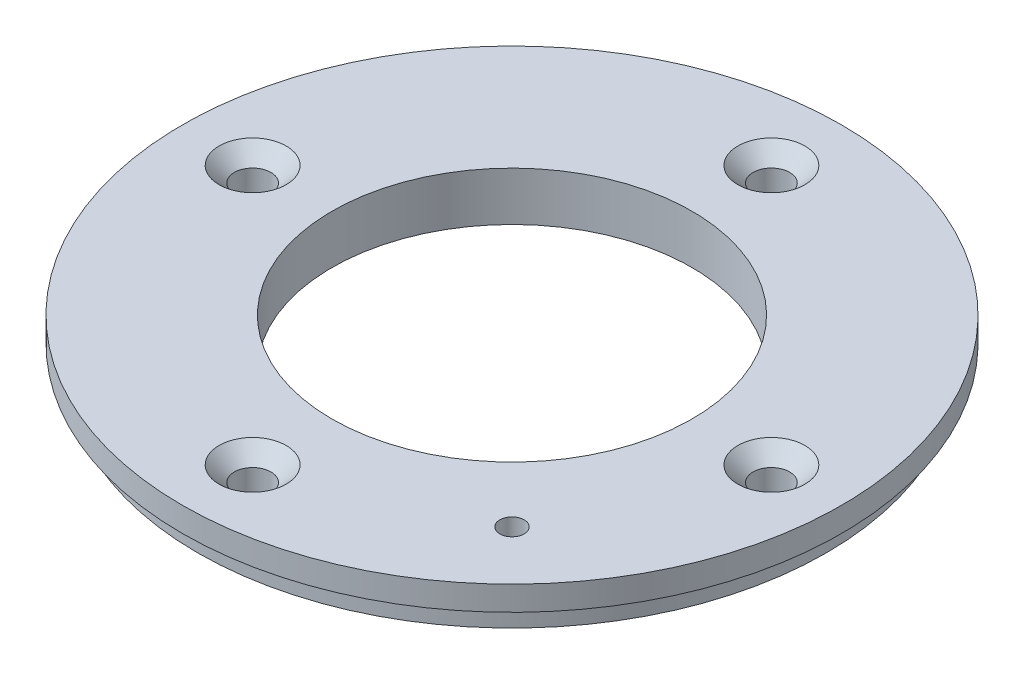
ISO-10303-21;
HEADER;
FILE_DESCRIPTION(('STEP AP214'),'2;1');
FILE_NAME('part.step','',(''),(''),'','','');
FILE_SCHEMA(('AUTOMOTIVE_DESIGN { 1 0 10303 214 1 1 1 1 }'));
ENDSEC;
DATA;
#1=APPLICATION_CONTEXT('core data for automotive mechanical design processes');
#2=APPLICATION_PROTOCOL_DEFINITION('international standard','automotive_design',2000,#1);
#3=PRODUCT_CONTEXT('',#1,'mechanical');
#4=PRODUCT('Part','Part','',(#3));
#5=PRODUCT_RELATED_PRODUCT_CATEGORY('part','',(#4));
#6=PRODUCT_DEFINITION_FORMATION('','',#4);
#7=PRODUCT_DEFINITION_CONTEXT('part definition',#1,'design');
#8=PRODUCT_DEFINITION('design','',#6,#7);
#9=PRODUCT_DEFINITION_SHAPE('','',#8);
#10=(LENGTH_UNIT() NAMED_UNIT(*) SI_UNIT(.MILLI.,.METRE.));
#11=(NAMED_UNIT(*) PLANE_ANGLE_UNIT() SI_UNIT($,.RADIAN.));
#12=(NAMED_UNIT(*) SI_UNIT($,.STERADIAN.) SOLID_ANGLE_UNIT());
#13=UNCERTAINTY_MEASURE_WITH_UNIT(LENGTH_MEASURE(1.E-05),#10,'distance_accuracy_value','');
#14=(GEOMETRIC_REPRESENTATION_CONTEXT(3) GLOBAL_UNCERTAINTY_ASSIGNED_CONTEXT((#13)) GLOBAL_UNIT_ASSIGNED_CONTEXT((#10,
#11,#12)) REPRESENTATION_CONTEXT('',''));
#15=CARTESIAN_POINT('',(0.,0.,0.));
#16=DIRECTION('',(0.,0.,1.));
#17=DIRECTION('',(1.,0.,0.));
#18=AXIS2_PLACEMENT_3D('',#15,#16,#17);
#19=CARTESIAN_POINT('',(0.,4.,0.));
#20=DIRECTION('',(0.,-1.,0.));
#21=DIRECTION('',(0.,0.,-1.));
#22=AXIS2_PLACEMENT_3D('',#19,#20,#21);
#23=CYLINDRICAL_SURFACE('',#22,51.5);
#24=CARTESIAN_POINT('',(0.,4.,0.));
#25=DIRECTION('',(0.,1.,0.));
#26=DIRECTION('',(0.,0.,1.));
#27=AXIS2_PLACEMENT_3D('',#24,#25,#26);
#28=CIRCLE('',#27,51.5);
#29=CARTESIAN_POINT('',(0.,4.,51.5));
#30=VERTEX_POINT('',#29);
#31=EDGE_CURVE('E65',#30,#30,#28,.T.);
#32=ORIENTED_EDGE('',*,*,#31,.F.);
#33=EDGE_LOOP('',(#32));
#34=FACE_BOUND('',#33,.T.);
#35=CARTESIAN_POINT('',(0.,0.,0.));
#36=DIRECTION('',(0.,1.,0.));
#37=DIRECTION('',(0.,0.,1.));
#38=AXIS2_PLACEMENT_3D('',#35,#36,#37);
#39=CIRCLE('',#38,51.5);
#40=CARTESIAN_POINT('',(0.,0.,51.5));
#41=VERTEX_POINT('',#40);
#42=EDGE_CURVE('E66',#41,#41,#39,.T.);
#43=ORIENTED_EDGE('',*,*,#42,.T.);
#44=EDGE_LOOP('',(#43));
#45=FACE_BOUND('',#44,.T.);
#46=ADVANCED_FACE('F33',(#34,#45),#23,.T.);
#47=CARTESIAN_POINT('',(0.,0.,0.));
#48=DIRECTION('',(0.,1.,0.));
#49=DIRECTION('',(0.,0.,1.));
#50=AXIS2_PLACEMENT_3D('',#47,#48,#49);
#51=PLANE('',#50);
#52=CARTESIAN_POINT('',(30.0520382004282,0.,30.0520382004283));
#53=DIRECTION('',(0.,1.,0.));
#54=DIRECTION('',(0.,0.,1.));
#55=AXIS2_PLACEMENT_3D('',#52,#53,#54);
#56=CIRCLE('',#55,2.);
#57=CARTESIAN_POINT('',(30.0520382004282,0.,32.0520382004283));
#58=VERTEX_POINT('',#57);
#59=EDGE_CURVE('E95',#58,#58,#56,.T.);
#60=ORIENTED_EDGE('',*,*,#59,.T.);
#61=EDGE_LOOP('',(#60));
#62=FACE_BOUND('',#61,.T.);
#63=CARTESIAN_POINT('',(42.5,0.,0.));
#64=DIRECTION('',(0.,1.,0.));
#65=DIRECTION('',(0.,0.,1.));
#66=AXIS2_PLACEMENT_3D('',#63,#64,#65);
#67=CIRCLE('',#66,3.);
#68=CARTESIAN_POINT('',(42.5,0.,3.));
#69=VERTEX_POINT('',#68);
#70=EDGE_CURVE('E92',#69,#69,#67,.T.);
#71=ORIENTED_EDGE('',*,*,#70,.T.);
#72=EDGE_LOOP('',(#71));
#73=FACE_BOUND('',#72,.T.);
#74=CARTESIAN_POINT('',(0.,0.,42.5));
#75=DIRECTION('',(0.,1.,0.));
#76=DIRECTION('',(0.,0.,1.));
#77=AXIS2_PLACEMENT_3D('',#74,#75,#76);
#78=CIRCLE('',#77,3.);
#79=CARTESIAN_POINT('',(0.,0.,45.5));
#80=VERTEX_POINT('',#79);
#81=EDGE_CURVE('E89',#80,#80,#78,.T.);
#82=ORIENTED_EDGE('',*,*,#81,.T.);
#83=EDGE_LOOP('',(#82));
#84=FACE_BOUND('',#83,.T.);
#85=CARTESIAN_POINT('',(-42.5,0.,0.));
#86=DIRECTION('',(0.,1.,0.));
#87=DIRECTION('',(0.,0.,1.));
#88=AXIS2_PLACEMENT_3D('',#85,#86,#87);
#89=CIRCLE('',#88,3.);
#90=CARTESIAN_POINT('',(-42.5,0.,3.));
#91=VERTEX_POINT('',#90);
#92=EDGE_CURVE('E86',#91,#91,#89,.T.);
#93=ORIENTED_EDGE('',*,*,#92,.T.);
#94=EDGE_LOOP('',(#93));
#95=FACE_BOUND('',#94,.T.);
#96=CARTESIAN_POINT('',(0.,0.,-42.5));
#97=DIRECTION('',(0.,1.,0.));
#98=DIRECTION('',(0.,0.,1.));
#99=AXIS2_PLACEMENT_3D('',#96,#97,#98);
#100=CIRCLE('',#99,3.);
#101=CARTESIAN_POINT('',(0.,0.,-39.5));
#102=VERTEX_POINT('',#101);
#103=EDGE_CURVE('E83',#102,#102,#100,.T.);
#104=ORIENTED_EDGE('',*,*,#103,.T.);
#105=EDGE_LOOP('',(#104));
#106=FACE_BOUND('',#105,.T.);
#107=CARTESIAN_POINT('',(0.,0.,0.));
#108=DIRECTION('',(0.,1.,0.));
#109=DIRECTION('',(0.,0.,1.));
#110=AXIS2_PLACEMENT_3D('',#107,#108,#109);
#111=CIRCLE('',#110,29.5);
#112=CARTESIAN_POINT('',(0.,0.,29.5));
#113=VERTEX_POINT('',#112);
#114=EDGE_CURVE('E75',#113,#113,#111,.T.);
#115=ORIENTED_EDGE('',*,*,#114,.T.);
#116=EDGE_LOOP('',(#115));
#117=FACE_BOUND('',#116,.T.);
#118=ORIENTED_EDGE('',*,*,#42,.F.);
#119=EDGE_LOOP('',(#118));
#120=FACE_BOUND('',#119,.T.);
#121=ADVANCED_FACE('F131',(#62,#73,#84,#95,#106,#117,#120),#51,.F.);
#122=CARTESIAN_POINT('',(0.,4.,0.));
#123=DIRECTION('',(0.,1.,0.));
#124=DIRECTION('',(0.,0.,1.));
#125=AXIS2_PLACEMENT_3D('',#122,#123,#124);
#126=PLANE('',#125);
#127=CARTESIAN_POINT('',(0.,4.,0.));
#128=DIRECTION('',(0.,1.,0.));
#129=DIRECTION('',(0.,0.,1.));
#130=AXIS2_PLACEMENT_3D('',#127,#128,#129);
#131=CIRCLE('',#130,54.);
#132=CARTESIAN_POINT('',(0.,4.,54.));
#133=VERTEX_POINT('',#132);
#134=EDGE_CURVE('E72',#133,#133,#131,.T.);
#135=ORIENTED_EDGE('',*,*,#134,.F.);
#136=EDGE_LOOP('',(#135));
#137=FACE_BOUND('',#136,.T.);
#138=ORIENTED_EDGE('',*,*,#31,.T.);
#139=EDGE_LOOP('',(#138));
#140=FACE_BOUND('',#139,.T.);
#141=ADVANCED_FACE('F125',(#137,#140),#126,.F.);
#142=CARTESIAN_POINT('',(0.,8.,0.));
#143=DIRECTION('',(0.,-1.,0.));
#144=DIRECTION('',(0.,0.,-1.));
#145=AXIS2_PLACEMENT_3D('',#142,#143,#144);
#146=CYLINDRICAL_SURFACE('',#145,54.);
#147=CARTESIAN_POINT('',(0.,8.,0.));
#148=DIRECTION('',(0.,1.,0.));
#149=DIRECTION('',(0.,0.,1.));
#150=AXIS2_PLACEMENT_3D('',#147,#148,#149);
#151=CIRCLE('',#150,54.);
#152=CARTESIAN_POINT('',(0.,8.,54.));
#153=VERTEX_POINT('',#152);
#154=EDGE_CURVE('E69',#153,#153,#151,.T.);
#155=ORIENTED_EDGE('',*,*,#154,.F.);
#156=EDGE_LOOP('',(#155));
#157=FACE_BOUND('',#156,.T.);
#158=ORIENTED_EDGE('',*,*,#134,.T.);
#159=EDGE_LOOP('',(#158));
#160=FACE_BOUND('',#159,.T.);
#161=ADVANCED_FACE('F109',(#157,#160),#146,.T.);
#162=CARTESIAN_POINT('',(0.,8.,0.));
#163=DIRECTION('',(0.,1.,0.));
#164=DIRECTION('',(0.,0.,1.));
#165=AXIS2_PLACEMENT_3D('',#162,#163,#164);
#166=PLANE('',#165);
#167=CARTESIAN_POINT('',(30.0520382004282,8.,30.0520382004283));
#168=DIRECTION('',(0.,1.,0.));
#169=DIRECTION('',(0.,0.,1.));
#170=AXIS2_PLACEMENT_3D('',#167,#168,#169);
#171=CIRCLE('',#170,2.);
#172=CARTESIAN_POINT('',(30.0520382004282,8.,32.0520382004283));
#173=VERTEX_POINT('',#172);
#174=EDGE_CURVE('E98',#173,#173,#171,.T.);
#175=ORIENTED_EDGE('',*,*,#174,.F.);
#176=EDGE_LOOP('',(#175));
#177=FACE_BOUND('',#176,.T.);
#178=CARTESIAN_POINT('',(0.,8.,42.5));
#179=DIRECTION('',(0.,1.,0.));
#180=DIRECTION('',(0.,0.,1.));
#181=AXIS2_PLACEMENT_3D('',#178,#179,#180);
#182=CIRCLE('',#181,5.50000000000003);
#183=CARTESIAN_POINT('',(0.,8.,48.));
#184=VERTEX_POINT('',#183);
#185=EDGE_CURVE('E48',#184,#184,#182,.F.);
#186=ORIENTED_EDGE('',*,*,#185,.T.);
#187=EDGE_LOOP('',(#186));
#188=FACE_BOUND('',#187,.T.);
#189=CARTESIAN_POINT('',(42.5,8.,0.));
#190=DIRECTION('',(0.,1.,0.));
#191=DIRECTION('',(0.,0.,1.));
#192=AXIS2_PLACEMENT_3D('',#189,#190,#191);
#193=CIRCLE('',#192,5.50000000000003);
#194=CARTESIAN_POINT('',(42.5,8.,5.50000000000003));
#195=VERTEX_POINT('',#194);
#196=EDGE_CURVE('E53',#195,#195,#193,.F.);
#197=ORIENTED_EDGE('',*,*,#196,.T.);
#198=EDGE_LOOP('',(#197));
#199=FACE_BOUND('',#198,.T.);
#200=CARTESIAN_POINT('',(0.,8.,-42.5));
#201=DIRECTION('',(0.,1.,0.));
#202=DIRECTION('',(0.,0.,1.));
#203=AXIS2_PLACEMENT_3D('',#200,#201,#202);
#204=CIRCLE('',#203,5.50000000000003);
#205=CARTESIAN_POINT('',(0.,8.,-37.));
#206=VERTEX_POINT('',#205);
#207=EDGE_CURVE('E56',#206,#206,#204,.F.);
#208=ORIENTED_EDGE('',*,*,#207,.T.);
#209=EDGE_LOOP('',(#208));
#210=FACE_BOUND('',#209,.T.);
#211=CARTESIAN_POINT('',(-42.5,8.,0.));
#212=DIRECTION('',(0.,1.,0.));
#213=DIRECTION('',(0.,0.,1.));
#214=AXIS2_PLACEMENT_3D('',#211,#212,#213);
#215=CIRCLE('',#214,5.50000000000003);
#216=CARTESIAN_POINT('',(-42.5,8.,5.50000000000003));
#217=VERTEX_POINT('',#216);
#218=EDGE_CURVE('E59',#217,#217,#215,.F.);
#219=ORIENTED_EDGE('',*,*,#218,.T.);
#220=EDGE_LOOP('',(#219));
#221=FACE_BOUND('',#220,.T.);
#222=CARTESIAN_POINT('',(0.,8.,0.));
#223=DIRECTION('',(0.,1.,0.));
#224=DIRECTION('',(0.,0.,1.));
#225=AXIS2_PLACEMENT_3D('',#222,#223,#224);
#226=CIRCLE('',#225,29.5);
#227=CARTESIAN_POINT('',(0.,8.,29.5));
#228=VERTEX_POINT('',#227);
#229=EDGE_CURVE('E80',#228,#228,#226,.T.);
#230=ORIENTED_EDGE('',*,*,#229,.F.);
#231=EDGE_LOOP('',(#230));
#232=FACE_BOUND('',#231,.T.);
#233=ORIENTED_EDGE('',*,*,#154,.T.);
#234=EDGE_LOOP('',(#233));
#235=FACE_BOUND('',#234,.T.);
#236=ADVANCED_FACE('F105',(#177,#188,#199,#210,#221,#232,#235),#166,.T.);
#237=CARTESIAN_POINT('',(0.,-2.,0.));
#238=DIRECTION('',(0.,1.,0.));
#239=DIRECTION('',(0.,0.,1.));
#240=AXIS2_PLACEMENT_3D('',#237,#238,#239);
#241=CYLINDRICAL_SURFACE('',#240,29.5);
#242=ORIENTED_EDGE('',*,*,#229,.T.);
#243=EDGE_LOOP('',(#242));
#244=FACE_BOUND('',#243,.T.);
#245=ORIENTED_EDGE('',*,*,#114,.F.);
#246=EDGE_LOOP('',(#245));
#247=FACE_BOUND('',#246,.T.);
#248=ADVANCED_FACE('F108',(#244,#247),#241,.F.);
#249=CARTESIAN_POINT('',(0.,-2.,-42.5));
#250=DIRECTION('',(0.,1.,0.));
#251=DIRECTION('',(0.,0.,1.));
#252=AXIS2_PLACEMENT_3D('',#249,#250,#251);
#253=CYLINDRICAL_SURFACE('',#252,3.);
#254=CARTESIAN_POINT('',(0.,5.49999999999997,-42.5));
#255=DIRECTION('',(0.,1.,0.));
#256=DIRECTION('',(0.,0.,1.));
#257=AXIS2_PLACEMENT_3D('',#254,#255,#256);
#258=CIRCLE('',#257,3.);
#259=CARTESIAN_POINT('',(0.,5.49999999999997,-39.5));
#260=VERTEX_POINT('',#259);
#261=EDGE_CURVE('E40',#260,#260,#258,.T.);
#262=ORIENTED_EDGE('',*,*,#261,.T.);
#263=EDGE_LOOP('',(#262));
#264=FACE_BOUND('',#263,.T.);
#265=ORIENTED_EDGE('',*,*,#103,.F.);
#266=EDGE_LOOP('',(#265));
#267=FACE_BOUND('',#266,.T.);
#268=ADVANCED_FACE('F181',(#264,#267),#253,.F.);
#269=CARTESIAN_POINT('',(-42.5,-2.,0.));
#270=DIRECTION('',(0.,1.,0.));
#271=DIRECTION('',(0.,0.,1.));
#272=AXIS2_PLACEMENT_3D('',#269,#270,#271);
#273=CYLINDRICAL_SURFACE('',#272,3.);
#274=CARTESIAN_POINT('',(-42.5,5.49999999999997,0.));
#275=DIRECTION('',(0.,1.,0.));
#276=DIRECTION('',(0.,0.,1.));
#277=AXIS2_PLACEMENT_3D('',#274,#275,#276);
#278=CIRCLE('',#277,3.);
#279=CARTESIAN_POINT('',(-42.5,5.49999999999997,3.));
#280=VERTEX_POINT('',#279);
#281=EDGE_CURVE('E10',#280,#280,#278,.T.);
#282=ORIENTED_EDGE('',*,*,#281,.T.);
#283=EDGE_LOOP('',(#282));
#284=FACE_BOUND('',#283,.T.);
#285=ORIENTED_EDGE('',*,*,#92,.F.);
#286=EDGE_LOOP('',(#285));
#287=FACE_BOUND('',#286,.T.);
#288=ADVANCED_FACE('F177',(#284,#287),#273,.F.);
#289=CARTESIAN_POINT('',(0.,-2.,42.5));
#290=DIRECTION('',(0.,1.,0.));
#291=DIRECTION('',(0.,0.,1.));
#292=AXIS2_PLACEMENT_3D('',#289,#290,#291);
#293=CYLINDRICAL_SURFACE('',#292,3.);
#294=CARTESIAN_POINT('',(0.,5.49999999999997,42.5));
#295=DIRECTION('',(0.,1.,0.));
#296=DIRECTION('',(0.,0.,1.));
#297=AXIS2_PLACEMENT_3D('',#294,#295,#296);
#298=CIRCLE('',#297,3.);
#299=CARTESIAN_POINT('',(0.,5.49999999999997,45.5));
#300=VERTEX_POINT('',#299);
#301=EDGE_CURVE('E62',#300,#300,#298,.T.);
#302=ORIENTED_EDGE('',*,*,#301,.T.);
#303=EDGE_LOOP('',(#302));
#304=FACE_BOUND('',#303,.T.);
#305=ORIENTED_EDGE('',*,*,#81,.F.);
#306=EDGE_LOOP('',(#305));
#307=FACE_BOUND('',#306,.T.);
#308=ADVANCED_FACE('F173',(#304,#307),#293,.F.);
#309=CARTESIAN_POINT('',(42.5,-2.,0.));
#310=DIRECTION('',(0.,1.,0.));
#311=DIRECTION('',(0.,0.,1.));
#312=AXIS2_PLACEMENT_3D('',#309,#310,#311);
#313=CYLINDRICAL_SURFACE('',#312,3.);
#314=CARTESIAN_POINT('',(42.5,5.49999999999997,0.));
#315=DIRECTION('',(0.,1.,0.));
#316=DIRECTION('',(0.,0.,1.));
#317=AXIS2_PLACEMENT_3D('',#314,#315,#316);
#318=CIRCLE('',#317,3.);
#319=CARTESIAN_POINT('',(42.5,5.49999999999997,3.));
#320=VERTEX_POINT('',#319);
#321=EDGE_CURVE('E44',#320,#320,#318,.T.);
#322=ORIENTED_EDGE('',*,*,#321,.T.);
#323=EDGE_LOOP('',(#322));
#324=FACE_BOUND('',#323,.T.);
#325=ORIENTED_EDGE('',*,*,#70,.F.);
#326=EDGE_LOOP('',(#325));
#327=FACE_BOUND('',#326,.T.);
#328=ADVANCED_FACE('F152',(#324,#327),#313,.F.);
#329=CARTESIAN_POINT('',(0.,5.49999999999997,42.5));
#330=DIRECTION('',(0.,1.,0.));
#331=DIRECTION('',(0.,0.,1.));
#332=AXIS2_PLACEMENT_3D('',#329,#330,#331);
#333=CONICAL_SURFACE('',#332,3.,0.785398163397449);
#334=ORIENTED_EDGE('',*,*,#185,.F.);
#335=EDGE_LOOP('',(#334));
#336=FACE_BOUND('',#335,.T.);
#337=ORIENTED_EDGE('',*,*,#301,.F.);
#338=EDGE_LOOP('',(#337));
#339=FACE_BOUND('',#338,.T.);
#340=ADVANCED_FACE('F148',(#336,#339),#333,.F.);
#341=CARTESIAN_POINT('',(42.5,5.49999999999997,0.));
#342=DIRECTION('',(0.,1.,0.));
#343=DIRECTION('',(0.,0.,1.));
#344=AXIS2_PLACEMENT_3D('',#341,#342,#343);
#345=CONICAL_SURFACE('',#344,3.,0.785398163397449);
#346=CARTESIAN_POINT('',(42.5,8.,5.50000000000003));
#347=CARTESIAN_POINT('',(42.5,7.97395833333333,5.47395833333336));
#348=CARTESIAN_POINT('',(42.5,7.94791666666667,5.4479166666667));
#349=CARTESIAN_POINT('',(42.5,7.89583333333333,5.39583333333336));
#350=CARTESIAN_POINT('',(42.5,7.86979166666666,5.3697916666667));
#351=CARTESIAN_POINT('',(42.5,7.81770833333333,5.31770833333336));
#352=CARTESIAN_POINT('',(42.5,7.79166666666666,5.2916666666667));
#353=CARTESIAN_POINT('',(42.5,7.73958333333333,5.23958333333336));
#354=CARTESIAN_POINT('',(42.5,7.71354166666666,5.21354166666669));
#355=CARTESIAN_POINT('',(42.5,7.66145833333333,5.16145833333336));
#356=CARTESIAN_POINT('',(42.5,7.63541666666666,5.13541666666669));
#357=CARTESIAN_POINT('',(42.5,7.58333333333333,5.08333333333336));
#358=CARTESIAN_POINT('',(42.5,7.55729166666666,5.05729166666669));
#359=CARTESIAN_POINT('',(42.5,7.50520833333333,5.00520833333336));
#360=CARTESIAN_POINT('',(42.5,7.47916666666666,4.97916666666669));
#361=CARTESIAN_POINT('',(42.5,7.42708333333333,4.92708333333336));
#362=CARTESIAN_POINT('',(42.5,7.40104166666666,4.90104166666669));
#363=CARTESIAN_POINT('',(42.5,7.34895833333333,4.84895833333336));
#364=CARTESIAN_POINT('',(42.5,7.32291666666666,4.82291666666669));
#365=CARTESIAN_POINT('',(42.5,7.27083333333332,4.77083333333336));
#366=CARTESIAN_POINT('',(42.5,7.24479166666666,4.74479166666669));
#367=CARTESIAN_POINT('',(42.5,7.19270833333332,4.69270833333335));
#368=CARTESIAN_POINT('',(42.5,7.16666666666666,4.66666666666669));
#369=CARTESIAN_POINT('',(42.5,7.11458333333332,4.61458333333335));
#370=CARTESIAN_POINT('',(42.5,7.08854166666666,4.58854166666669));
#371=CARTESIAN_POINT('',(42.5,7.03645833333332,4.53645833333335));
#372=CARTESIAN_POINT('',(42.5,7.01041666666666,4.51041666666669));
#373=CARTESIAN_POINT('',(42.5,6.95833333333332,4.45833333333335));
#374=CARTESIAN_POINT('',(42.5,6.93229166666666,4.43229166666668));
#375=CARTESIAN_POINT('',(42.5,6.88020833333332,4.38020833333335));
#376=CARTESIAN_POINT('',(42.5,6.85416666666665,4.35416666666668));
#377=CARTESIAN_POINT('',(42.5,6.80208333333332,4.30208333333335));
#378=CARTESIAN_POINT('',(42.5,6.77604166666665,4.27604166666668));
#379=CARTESIAN_POINT('',(42.5,6.72395833333332,4.22395833333335));
#380=CARTESIAN_POINT('',(42.5,6.69791666666665,4.19791666666668));
#381=CARTESIAN_POINT('',(42.5,6.64583333333332,4.14583333333335));
#382=CARTESIAN_POINT('',(42.5,6.61979166666665,4.11979166666668));
#383=CARTESIAN_POINT('',(42.5,6.56770833333332,4.06770833333335));
#384=CARTESIAN_POINT('',(42.5,6.54166666666665,4.04166666666668));
#385=CARTESIAN_POINT('',(42.5,6.48958333333332,3.98958333333335));
#386=CARTESIAN_POINT('',(42.5,6.46354166666665,3.96354166666668));
#387=CARTESIAN_POINT('',(42.5,6.41145833333332,3.91145833333335));
#388=CARTESIAN_POINT('',(42.5,6.38541666666665,3.88541666666668));
#389=CARTESIAN_POINT('',(42.5,6.33333333333332,3.83333333333334));
#390=CARTESIAN_POINT('',(42.5,6.30729166666665,3.80729166666668));
#391=CARTESIAN_POINT('',(42.5,6.25520833333331,3.75520833333334));
#392=CARTESIAN_POINT('',(42.5,6.22916666666665,3.72916666666668));
#393=CARTESIAN_POINT('',(42.5,6.17708333333331,3.67708333333334));
#394=CARTESIAN_POINT('',(42.5,6.15104166666665,3.65104166666668));
#395=CARTESIAN_POINT('',(42.5,6.09895833333331,3.59895833333334));
#396=CARTESIAN_POINT('',(42.5,6.07291666666665,3.57291666666667));
#397=CARTESIAN_POINT('',(42.5,6.02083333333331,3.52083333333334));
#398=CARTESIAN_POINT('',(42.5,5.99479166666664,3.49479166666667));
#399=CARTESIAN_POINT('',(42.5,5.94270833333331,3.44270833333334));
#400=CARTESIAN_POINT('',(42.5,5.91666666666664,3.41666666666667));
#401=CARTESIAN_POINT('',(42.5,5.86458333333331,3.36458333333334));
#402=CARTESIAN_POINT('',(42.5,5.83854166666664,3.33854166666667));
#403=CARTESIAN_POINT('',(42.5,5.78645833333331,3.28645833333334));
#404=CARTESIAN_POINT('',(42.5,5.76041666666664,3.26041666666667));
#405=CARTESIAN_POINT('',(42.5,5.70833333333331,3.20833333333334));
#406=CARTESIAN_POINT('',(42.5,5.68229166666664,3.18229166666667));
#407=CARTESIAN_POINT('',(42.5,5.63020833333331,3.13020833333334));
#408=CARTESIAN_POINT('',(42.5,5.60416666666664,3.10416666666667));
#409=CARTESIAN_POINT('',(42.5,5.55208333333331,3.05208333333333));
#410=CARTESIAN_POINT('',(42.5,5.52604166666664,3.02604166666667));
#411=CARTESIAN_POINT('',(42.5,5.49999999999997,3.));
#412=B_SPLINE_CURVE_WITH_KNOTS('',3,(#346,#347,#348,#349,#350,#351,#352,#353,#354,#355,#356,
#357,#358,#359,#360,#361,#362,#363,#364,#365,#366,#367,#368,#369,#370,#371,#372,#373,#374,#375,
#376,#377,#378,#379,#380,#381,#382,#383,#384,#385,#386,#387,#388,#389,#390,#391,#392,#393,#394,
#395,#396,#397,#398,#399,#400,#401,#402,#403,#404,#405,#406,#407,#408,#409,#410,#411),
.UNSPECIFIED.,.F.,.F.,(4,2,2,2,2,2,2,2,2,2,2,2,2,2,2,2,2,2,2,2,2,2,2,2,2,2,2,2,2,2,2,2,4),(0.,
0.110485434560398,0.220970869120798,0.331456303681197,0.441941738241597,0.552427172801996,
0.662912607362395,0.773398041922794,0.883883476483194,0.994368911043593,1.10485434560399,
1.21533978016439,1.32582521472479,1.43631064928519,1.54679608384559,1.65728151840599,
1.76776695296639,1.87825238752679,1.98873782208719,2.09922325664759,2.20970869120799,
2.32019412576838,2.43067956032878,2.54116499488918,2.65165042944958,2.76213586400998,
2.87262129857038,2.98310673313078,3.09359216769118,3.20407760225158,3.31456303681198,
3.42504847137238,3.53553390593278),.UNSPECIFIED.);
#413=EDGE_CURVE('BSEAM151',#195,#320,#412,.T.);
#414=ORIENTED_EDGE('',*,*,#196,.F.);
#415=ORIENTED_EDGE('',*,*,#321,.F.);
#416=ORIENTED_EDGE('',*,*,#413,.T.);
#417=ORIENTED_EDGE('',*,*,#413,.F.);
#418=EDGE_LOOP('',(#414,#416,#415,#417));
#419=FACE_BOUND('',#418,.T.);
#420=ADVANCED_FACE('F151',(#419),#345,.F.);
#421=CARTESIAN_POINT('',(0.,5.49999999999997,-42.5));
#422=DIRECTION('',(0.,1.,0.));
#423=DIRECTION('',(0.,0.,1.));
#424=AXIS2_PLACEMENT_3D('',#421,#422,#423);
#425=CONICAL_SURFACE('',#424,3.,0.785398163397449);
#426=ORIENTED_EDGE('',*,*,#207,.F.);
#427=EDGE_LOOP('',(#426));
#428=FACE_BOUND('',#427,.T.);
#429=ORIENTED_EDGE('',*,*,#261,.F.);
#430=EDGE_LOOP('',(#429));
#431=FACE_BOUND('',#430,.T.);
#432=ADVANCED_FACE('F155',(#428,#431),#425,.F.);
#433=CARTESIAN_POINT('',(-42.5,5.49999999999997,0.));
#434=DIRECTION('',(0.,1.,0.));
#435=DIRECTION('',(0.,0.,1.));
#436=AXIS2_PLACEMENT_3D('',#433,#434,#435);
#437=CONICAL_SURFACE('',#436,3.,0.785398163397449);
#438=CARTESIAN_POINT('',(-42.5,8.,5.50000000000003));
#439=CARTESIAN_POINT('',(-42.5,7.97395833333333,5.47395833333336));
#440=CARTESIAN_POINT('',(-42.5,7.94791666666667,5.4479166666667));
#441=CARTESIAN_POINT('',(-42.5,7.89583333333333,5.39583333333336));
#442=CARTESIAN_POINT('',(-42.5,7.86979166666666,5.3697916666667));
#443=CARTESIAN_POINT('',(-42.5,7.81770833333333,5.31770833333336));
#444=CARTESIAN_POINT('',(-42.5,7.79166666666666,5.2916666666667));
#445=CARTESIAN_POINT('',(-42.5,7.73958333333333,5.23958333333336));
#446=CARTESIAN_POINT('',(-42.5,7.71354166666666,5.21354166666669));
#447=CARTESIAN_POINT('',(-42.5,7.66145833333333,5.16145833333336));
#448=CARTESIAN_POINT('',(-42.5,7.63541666666666,5.13541666666669));
#449=CARTESIAN_POINT('',(-42.5,7.58333333333333,5.08333333333336));
#450=CARTESIAN_POINT('',(-42.5,7.55729166666666,5.05729166666669));
#451=CARTESIAN_POINT('',(-42.5,7.50520833333333,5.00520833333336));
#452=CARTESIAN_POINT('',(-42.5,7.47916666666666,4.97916666666669));
#453=CARTESIAN_POINT('',(-42.5,7.42708333333333,4.92708333333336));
#454=CARTESIAN_POINT('',(-42.5,7.40104166666666,4.90104166666669));
#455=CARTESIAN_POINT('',(-42.5,7.34895833333333,4.84895833333336));
#456=CARTESIAN_POINT('',(-42.5,7.32291666666666,4.82291666666669));
#457=CARTESIAN_POINT('',(-42.5,7.27083333333332,4.77083333333336));
#458=CARTESIAN_POINT('',(-42.5,7.24479166666666,4.74479166666669));
#459=CARTESIAN_POINT('',(-42.5,7.19270833333332,4.69270833333335));
#460=CARTESIAN_POINT('',(-42.5,7.16666666666666,4.66666666666669));
#461=CARTESIAN_POINT('',(-42.5,7.11458333333332,4.61458333333335));
#462=CARTESIAN_POINT('',(-42.5,7.08854166666666,4.58854166666669));
#463=CARTESIAN_POINT('',(-42.5,7.03645833333332,4.53645833333335));
#464=CARTESIAN_POINT('',(-42.5,7.01041666666666,4.51041666666669));
#465=CARTESIAN_POINT('',(-42.5,6.95833333333332,4.45833333333335));
#466=CARTESIAN_POINT('',(-42.5,6.93229166666666,4.43229166666668));
#467=CARTESIAN_POINT('',(-42.5,6.88020833333332,4.38020833333335));
#468=CARTESIAN_POINT('',(-42.5,6.85416666666665,4.35416666666668));
#469=CARTESIAN_POINT('',(-42.5,6.80208333333332,4.30208333333335));
#470=CARTESIAN_POINT('',(-42.5,6.77604166666665,4.27604166666668));
#471=CARTESIAN_POINT('',(-42.5,6.72395833333332,4.22395833333335));
#472=CARTESIAN_POINT('',(-42.5,6.69791666666665,4.19791666666668));
#473=CARTESIAN_POINT('',(-42.5,6.64583333333332,4.14583333333335));
#474=CARTESIAN_POINT('',(-42.5,6.61979166666665,4.11979166666668));
#475=CARTESIAN_POINT('',(-42.5,6.56770833333332,4.06770833333335));
#476=CARTESIAN_POINT('',(-42.5,6.54166666666665,4.04166666666668));
#477=CARTESIAN_POINT('',(-42.5,6.48958333333332,3.98958333333335));
#478=CARTESIAN_POINT('',(-42.5,6.46354166666665,3.96354166666668));
#479=CARTESIAN_POINT('',(-42.5,6.41145833333332,3.91145833333335));
#480=CARTESIAN_POINT('',(-42.5,6.38541666666665,3.88541666666668));
#481=CARTESIAN_POINT('',(-42.5,6.33333333333332,3.83333333333334));
#482=CARTESIAN_POINT('',(-42.5,6.30729166666665,3.80729166666668));
#483=CARTESIAN_POINT('',(-42.5,6.25520833333331,3.75520833333334));
#484=CARTESIAN_POINT('',(-42.5,6.22916666666665,3.72916666666668));
#485=CARTESIAN_POINT('',(-42.5,6.17708333333331,3.67708333333334));
#486=CARTESIAN_POINT('',(-42.5,6.15104166666665,3.65104166666668));
#487=CARTESIAN_POINT('',(-42.5,6.09895833333331,3.59895833333334));
#488=CARTESIAN_POINT('',(-42.5,6.07291666666665,3.57291666666667));
#489=CARTESIAN_POINT('',(-42.5,6.02083333333331,3.52083333333334));
#490=CARTESIAN_POINT('',(-42.5,5.99479166666664,3.49479166666667));
#491=CARTESIAN_POINT('',(-42.5,5.94270833333331,3.44270833333334));
#492=CARTESIAN_POINT('',(-42.5,5.91666666666664,3.41666666666667));
#493=CARTESIAN_POINT('',(-42.5,5.86458333333331,3.36458333333334));
#494=CARTESIAN_POINT('',(-42.5,5.83854166666664,3.33854166666667));
#495=CARTESIAN_POINT('',(-42.5,5.78645833333331,3.28645833333334));
#496=CARTESIAN_POINT('',(-42.5,5.76041666666664,3.26041666666667));
#497=CARTESIAN_POINT('',(-42.5,5.70833333333331,3.20833333333334));
#498=CARTESIAN_POINT('',(-42.5,5.68229166666664,3.18229166666667));
#499=CARTESIAN_POINT('',(-42.5,5.63020833333331,3.13020833333334));
#500=CARTESIAN_POINT('',(-42.5,5.60416666666664,3.10416666666667));
#501=CARTESIAN_POINT('',(-42.5,5.55208333333331,3.05208333333333));
#502=CARTESIAN_POINT('',(-42.5,5.52604166666664,3.02604166666667));
#503=CARTESIAN_POINT('',(-42.5,5.49999999999997,3.));
#504=B_SPLINE_CURVE_WITH_KNOTS('',3,(#438,#439,#440,#441,#442,#443,#444,#445,#446,#447,#448,
#449,#450,#451,#452,#453,#454,#455,#456,#457,#458,#459,#460,#461,#462,#463,#464,#465,#466,#467,
#468,#469,#470,#471,#472,#473,#474,#475,#476,#477,#478,#479,#480,#481,#482,#483,#484,#485,#486,
#487,#488,#489,#490,#491,#492,#493,#494,#495,#496,#497,#498,#499,#500,#501,#502,#503),
.UNSPECIFIED.,.F.,.F.,(4,2,2,2,2,2,2,2,2,2,2,2,2,2,2,2,2,2,2,2,2,2,2,2,2,2,2,2,2,2,2,2,4),(0.,
0.110485434560398,0.220970869120798,0.331456303681197,0.441941738241597,0.552427172801996,
0.662912607362395,0.773398041922794,0.883883476483194,0.994368911043593,1.10485434560399,
1.21533978016439,1.32582521472479,1.43631064928519,1.54679608384559,1.65728151840599,
1.76776695296639,1.87825238752679,1.98873782208719,2.09922325664759,2.20970869120799,
2.32019412576838,2.43067956032878,2.54116499488918,2.65165042944958,2.76213586400998,
2.87262129857038,2.98310673313078,3.09359216769118,3.20407760225158,3.31456303681198,
3.42504847137238,3.53553390593278),.UNSPECIFIED.);
#505=EDGE_CURVE('BSEAM35',#217,#280,#504,.T.);
#506=ORIENTED_EDGE('',*,*,#218,.F.);
#507=ORIENTED_EDGE('',*,*,#281,.F.);
#508=ORIENTED_EDGE('',*,*,#505,.T.);
#509=ORIENTED_EDGE('',*,*,#505,.F.);
#510=EDGE_LOOP('',(#506,#508,#507,#509));
#511=FACE_BOUND('',#510,.T.);
#512=ADVANCED_FACE('F35',(#511),#437,.F.);
#513=CARTESIAN_POINT('',(30.0520382004282,-2.,30.0520382004283));
#514=DIRECTION('',(0.,1.,0.));
#515=DIRECTION('',(0.,0.,1.));
#516=AXIS2_PLACEMENT_3D('',#513,#514,#515);
#517=CYLINDRICAL_SURFACE('',#516,2.);
#518=ORIENTED_EDGE('',*,*,#174,.T.);
#519=EDGE_LOOP('',(#518));
#520=FACE_BOUND('',#519,.T.);
#521=ORIENTED_EDGE('',*,*,#59,.F.);
#522=EDGE_LOOP('',(#521));
#523=FACE_BOUND('',#522,.T.);
#524=ADVANCED_FACE('F102',(#520,#523),#517,.F.);
#525=CLOSED_SHELL('',(#46,#121,#141,#161,#236,#248,#268,#288,#308,#328,#340,#420,#432,#512,#524));
#526=MANIFOLD_SOLID_BREP('B2',#525);
#527=ADVANCED_BREP_SHAPE_REPRESENTATION('',(#18,#526),#14);
#528=SHAPE_DEFINITION_REPRESENTATION(#9,#527);
ENDSEC;
END-ISO-10303-21;
